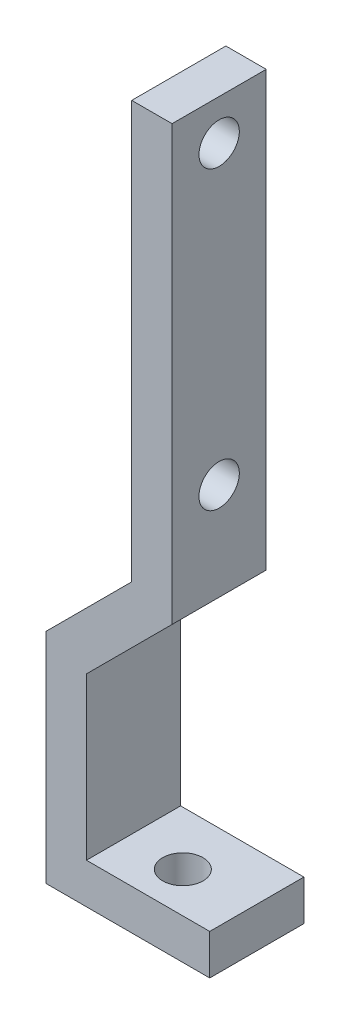
ISO-10303-21;
HEADER;
FILE_DESCRIPTION(('STEP AP214'),'2;1');
FILE_NAME('part.step','',(''),(''),'','','');
FILE_SCHEMA(('AUTOMOTIVE_DESIGN { 1 0 10303 214 1 1 1 1 }'));
ENDSEC;
DATA;
#1=APPLICATION_CONTEXT('core data for automotive mechanical design processes');
#2=APPLICATION_PROTOCOL_DEFINITION('international standard','automotive_design',2000,#1);
#3=PRODUCT_CONTEXT('',#1,'mechanical');
#4=PRODUCT('Part','Part','',(#3));
#5=PRODUCT_RELATED_PRODUCT_CATEGORY('part','',(#4));
#6=PRODUCT_DEFINITION_FORMATION('','',#4);
#7=PRODUCT_DEFINITION_CONTEXT('part definition',#1,'design');
#8=PRODUCT_DEFINITION('design','',#6,#7);
#9=PRODUCT_DEFINITION_SHAPE('','',#8);
#10=(LENGTH_UNIT() NAMED_UNIT(*) SI_UNIT(.MILLI.,.METRE.));
#11=(NAMED_UNIT(*) PLANE_ANGLE_UNIT() SI_UNIT($,.RADIAN.));
#12=(NAMED_UNIT(*) SI_UNIT($,.STERADIAN.) SOLID_ANGLE_UNIT());
#13=UNCERTAINTY_MEASURE_WITH_UNIT(LENGTH_MEASURE(1.E-05),#10,'distance_accuracy_value','');
#14=(GEOMETRIC_REPRESENTATION_CONTEXT(3) GLOBAL_UNCERTAINTY_ASSIGNED_CONTEXT((#13)) GLOBAL_UNIT_ASSIGNED_CONTEXT((#10,
#11,#12)) REPRESENTATION_CONTEXT('',''));
#15=CARTESIAN_POINT('',(0.,0.,0.));
#16=DIRECTION('',(0.,0.,1.));
#17=DIRECTION('',(1.,0.,0.));
#18=AXIS2_PLACEMENT_3D('',#15,#16,#17);
#19=CARTESIAN_POINT('',(0.,-31.6198785237269,7.));
#20=DIRECTION('',(0.,1.,0.));
#21=DIRECTION('',(0.,0.,1.));
#22=AXIS2_PLACEMENT_3D('',#19,#20,#21);
#23=PLANE('',#22);
#24=CARTESIAN_POINT('',(-2.84108024311403,-31.6198785237269,4.));
#25=DIRECTION('',(0.,1.,0.));
#26=DIRECTION('',(0.,0.,1.));
#27=AXIS2_PLACEMENT_3D('',#24,#25,#26);
#28=CIRCLE('',#27,1.5);
#29=CARTESIAN_POINT('',(-2.84108024311403,-31.6198785237269,5.5));
#30=VERTEX_POINT('',#29);
#31=EDGE_CURVE('E220',#30,#30,#28,.T.);
#32=ORIENTED_EDGE('',*,*,#31,.T.);
#33=EDGE_LOOP('',(#32));
#34=FACE_BOUND('',#33,.T.);
#35=DIRECTION('',(1.,0.,0.));
#36=VECTOR('',#35,1.);
#37=CARTESIAN_POINT('',(0.,-31.6198785237269,0.));
#38=LINE('',#37,#36);
#39=CARTESIAN_POINT('',(-10.005041273793,-31.6198785237269,0.));
#40=VERTEX_POINT('',#39);
#41=CARTESIAN_POINT('',(2.15891975688597,-31.6198785237269,0.));
#42=VERTEX_POINT('',#41);
#43=EDGE_CURVE('E145',#40,#42,#38,.T.);
#44=ORIENTED_EDGE('',*,*,#43,.T.);
#45=DIRECTION('',(0.,0.,-1.));
#46=VECTOR('',#45,1.);
#47=CARTESIAN_POINT('',(2.15891975688597,-31.6198785237269,7.));
#48=LINE('',#47,#46);
#49=CARTESIAN_POINT('',(2.15891975688597,-31.6198785237269,7.));
#50=VERTEX_POINT('',#49);
#51=EDGE_CURVE('E11',#50,#42,#48,.T.);
#52=ORIENTED_EDGE('',*,*,#51,.F.);
#53=DIRECTION('',(1.,0.,0.));
#54=VECTOR('',#53,1.);
#55=CARTESIAN_POINT('',(0.,-31.6198785237269,7.));
#56=LINE('',#55,#54);
#57=CARTESIAN_POINT('',(-10.005041273793,-31.6198785237269,7.));
#58=VERTEX_POINT('',#57);
#59=EDGE_CURVE('E164',#58,#50,#56,.T.);
#60=ORIENTED_EDGE('',*,*,#59,.F.);
#61=DIRECTION('',(0.,0.,-1.));
#62=VECTOR('',#61,1.);
#63=CARTESIAN_POINT('',(-10.005041273793,-31.6198785237269,7.));
#64=LINE('',#63,#62);
#65=EDGE_CURVE('E141',#58,#40,#64,.T.);
#66=ORIENTED_EDGE('',*,*,#65,.T.);
#67=EDGE_LOOP('',(#44,#52,#60,#66));
#68=FACE_BOUND('',#67,.T.);
#69=ADVANCED_FACE('F37',(#34,#68),#23,.F.);
#70=CARTESIAN_POINT('',(2.15891975688597,0.,7.));
#71=DIRECTION('',(-1.,0.,0.));
#72=DIRECTION('',(0.,-1.,0.));
#73=AXIS2_PLACEMENT_3D('',#70,#71,#72);
#74=PLANE('',#73);
#75=DIRECTION('',(0.,1.,0.));
#76=VECTOR('',#75,1.);
#77=CARTESIAN_POINT('',(2.15891975688597,0.,0.));
#78=LINE('',#77,#76);
#79=CARTESIAN_POINT('',(2.15891975688597,-28.6198785237269,0.));
#80=VERTEX_POINT('',#79);
#81=EDGE_CURVE('E148',#42,#80,#78,.T.);
#82=ORIENTED_EDGE('',*,*,#81,.T.);
#83=DIRECTION('',(0.,0.,-1.));
#84=VECTOR('',#83,1.);
#85=CARTESIAN_POINT('',(2.15891975688597,-28.6198785237269,7.));
#86=LINE('',#85,#84);
#87=CARTESIAN_POINT('',(2.15891975688597,-28.6198785237269,7.));
#88=VERTEX_POINT('',#87);
#89=EDGE_CURVE('E45',#88,#80,#86,.T.);
#90=ORIENTED_EDGE('',*,*,#89,.F.);
#91=DIRECTION('',(0.,1.,0.));
#92=VECTOR('',#91,1.);
#93=CARTESIAN_POINT('',(2.15891975688597,0.,7.));
#94=LINE('',#93,#92);
#95=EDGE_CURVE('E102',#50,#88,#94,.T.);
#96=ORIENTED_EDGE('',*,*,#95,.F.);
#97=ORIENTED_EDGE('',*,*,#51,.T.);
#98=EDGE_LOOP('',(#82,#90,#96,#97));
#99=FACE_BOUND('',#98,.T.);
#100=ADVANCED_FACE('F233',(#99),#74,.F.);
#101=CARTESIAN_POINT('',(0.,-28.6198785237269,7.));
#102=DIRECTION('',(0.,-1.,0.));
#103=DIRECTION('',(0.,0.,-1.));
#104=AXIS2_PLACEMENT_3D('',#101,#102,#103);
#105=PLANE('',#104);
#106=CARTESIAN_POINT('',(-2.84108024311403,-28.6198785237269,4.));
#107=DIRECTION('',(0.,1.,0.));
#108=DIRECTION('',(0.,0.,1.));
#109=AXIS2_PLACEMENT_3D('',#106,#107,#108);
#110=CIRCLE('',#109,1.5);
#111=CARTESIAN_POINT('',(-2.84108024311403,-28.6198785237269,5.5));
#112=VERTEX_POINT('',#111);
#113=EDGE_CURVE('E225',#112,#112,#110,.T.);
#114=ORIENTED_EDGE('',*,*,#113,.F.);
#115=EDGE_LOOP('',(#114));
#116=FACE_BOUND('',#115,.T.);
#117=DIRECTION('',(-1.,0.,0.));
#118=VECTOR('',#117,1.);
#119=CARTESIAN_POINT('',(0.,-28.6198785237269,0.));
#120=LINE('',#119,#118);
#121=CARTESIAN_POINT('',(-7.00504127379296,-28.6198785237269,0.));
#122=VERTEX_POINT('',#121);
#123=EDGE_CURVE('E151',#80,#122,#120,.T.);
#124=ORIENTED_EDGE('',*,*,#123,.T.);
#125=DIRECTION('',(0.,0.,-1.));
#126=VECTOR('',#125,1.);
#127=CARTESIAN_POINT('',(-7.00504127379296,-28.6198785237269,7.));
#128=LINE('',#127,#126);
#129=CARTESIAN_POINT('',(-7.00504127379296,-28.6198785237269,7.));
#130=VERTEX_POINT('',#129);
#131=EDGE_CURVE('E177',#130,#122,#128,.T.);
#132=ORIENTED_EDGE('',*,*,#131,.F.);
#133=DIRECTION('',(-1.,0.,0.));
#134=VECTOR('',#133,1.);
#135=CARTESIAN_POINT('',(0.,-28.6198785237269,7.));
#136=LINE('',#135,#134);
#137=EDGE_CURVE('E185',#88,#130,#136,.T.);
#138=ORIENTED_EDGE('',*,*,#137,.F.);
#139=ORIENTED_EDGE('',*,*,#89,.T.);
#140=EDGE_LOOP('',(#124,#132,#138,#139));
#141=FACE_BOUND('',#140,.T.);
#142=ADVANCED_FACE('F183',(#116,#141),#105,.F.);
#143=CARTESIAN_POINT('',(-7.00504127379296,0.,7.));
#144=DIRECTION('',(-1.,0.,0.));
#145=DIRECTION('',(0.,-1.,0.));
#146=AXIS2_PLACEMENT_3D('',#143,#144,#145);
#147=PLANE('',#146);
#148=DIRECTION('',(0.,1.,0.));
#149=VECTOR('',#148,1.);
#150=CARTESIAN_POINT('',(-7.00504127379296,0.,0.));
#151=LINE('',#150,#149);
#152=CARTESIAN_POINT('',(-7.00504127379296,-16.6198785237268,0.));
#153=VERTEX_POINT('',#152);
#154=EDGE_CURVE('E153',#122,#153,#151,.T.);
#155=ORIENTED_EDGE('',*,*,#154,.T.);
#156=DIRECTION('',(0.,0.,-1.));
#157=VECTOR('',#156,1.);
#158=CARTESIAN_POINT('',(-7.00504127379296,-16.6198785237268,7.));
#159=LINE('',#158,#157);
#160=CARTESIAN_POINT('',(-7.00504127379296,-16.6198785237268,7.));
#161=VERTEX_POINT('',#160);
#162=EDGE_CURVE('E174',#161,#153,#159,.T.);
#163=ORIENTED_EDGE('',*,*,#162,.F.);
#164=DIRECTION('',(0.,1.,0.));
#165=VECTOR('',#164,1.);
#166=CARTESIAN_POINT('',(-7.00504127379296,0.,7.));
#167=LINE('',#166,#165);
#168=EDGE_CURVE('E203',#130,#161,#167,.T.);
#169=ORIENTED_EDGE('',*,*,#168,.F.);
#170=ORIENTED_EDGE('',*,*,#131,.T.);
#171=EDGE_LOOP('',(#155,#163,#169,#170));
#172=FACE_BOUND('',#171,.T.);
#173=ADVANCED_FACE('F194',(#172),#147,.F.);
#174=CARTESIAN_POINT('',(4.80741862496694,-4.80741862496694,7.));
#175=DIRECTION('',(-0.707106781186547,0.707106781186547,0.));
#176=DIRECTION('',(-0.707106781186548,-0.707106781186548,0.));
#177=AXIS2_PLACEMENT_3D('',#174,#175,#176);
#178=PLANE('',#177);
#179=DIRECTION('',(0.707106781186548,0.707106781186548,0.));
#180=VECTOR('',#179,1.);
#181=CARTESIAN_POINT('',(4.80741862496694,-4.80741862496694,0.));
#182=LINE('',#181,#180);
#183=CARTESIAN_POINT('',(-0.64108024311404,-10.2559174930479,0.));
#184=VERTEX_POINT('',#183);
#185=EDGE_CURVE('E155',#153,#184,#182,.T.);
#186=ORIENTED_EDGE('',*,*,#185,.T.);
#187=DIRECTION('',(0.,0.,-1.));
#188=VECTOR('',#187,1.);
#189=CARTESIAN_POINT('',(-0.64108024311404,-10.2559174930479,7.));
#190=LINE('',#189,#188);
#191=CARTESIAN_POINT('',(-0.64108024311404,-10.2559174930479,7.));
#192=VERTEX_POINT('',#191);
#193=EDGE_CURVE('E171',#192,#184,#190,.T.);
#194=ORIENTED_EDGE('',*,*,#193,.F.);
#195=DIRECTION('',(0.707106781186548,0.707106781186548,0.));
#196=VECTOR('',#195,1.);
#197=CARTESIAN_POINT('',(4.80741862496694,-4.80741862496694,7.));
#198=LINE('',#197,#196);
#199=EDGE_CURVE('E200',#161,#192,#198,.T.);
#200=ORIENTED_EDGE('',*,*,#199,.F.);
#201=ORIENTED_EDGE('',*,*,#162,.T.);
#202=EDGE_LOOP('',(#186,#194,#200,#201));
#203=FACE_BOUND('',#202,.T.);
#204=ADVANCED_FACE('F198',(#203),#178,.F.);
#205=CARTESIAN_POINT('',(-0.641080243114038,0.,7.));
#206=DIRECTION('',(-1.,0.,0.));
#207=DIRECTION('',(0.,0.,1.));
#208=AXIS2_PLACEMENT_3D('',#205,#206,#207);
#209=PLANE('',#208);
#210=CARTESIAN_POINT('',(-0.641080243114038,18.9867231940714,3.5));
#211=DIRECTION('',(-1.,0.,0.));
#212=DIRECTION('',(0.,0.,1.));
#213=AXIS2_PLACEMENT_3D('',#210,#211,#212);
#214=CIRCLE('',#213,1.5);
#215=CARTESIAN_POINT('',(-0.641080243114038,18.9867231940714,5.));
#216=VERTEX_POINT('',#215);
#217=EDGE_CURVE('E149',#216,#216,#214,.T.);
#218=ORIENTED_EDGE('',*,*,#217,.T.);
#219=EDGE_LOOP('',(#218));
#220=FACE_BOUND('',#219,.T.);
#221=CARTESIAN_POINT('',(-0.641080243114039,-3.01327680592863,3.5));
#222=DIRECTION('',(-1.,0.,0.));
#223=DIRECTION('',(0.,0.,1.));
#224=AXIS2_PLACEMENT_3D('',#221,#222,#223);
#225=CIRCLE('',#224,1.5);
#226=CARTESIAN_POINT('',(-0.641080243114039,-3.01327680592863,5.));
#227=VERTEX_POINT('',#226);
#228=EDGE_CURVE('E213',#227,#227,#225,.T.);
#229=ORIENTED_EDGE('',*,*,#228,.T.);
#230=EDGE_LOOP('',(#229));
#231=FACE_BOUND('',#230,.T.);
#232=DIRECTION('',(0.,1.,0.));
#233=VECTOR('',#232,1.);
#234=CARTESIAN_POINT('',(-0.641080243114038,0.,0.));
#235=LINE('',#234,#233);
#236=CARTESIAN_POINT('',(-0.641080243114038,21.9867231940714,0.));
#237=VERTEX_POINT('',#236);
#238=EDGE_CURVE('E157',#184,#237,#235,.T.);
#239=ORIENTED_EDGE('',*,*,#238,.T.);
#240=DIRECTION('',(0.,0.,-1.));
#241=VECTOR('',#240,1.);
#242=CARTESIAN_POINT('',(-0.641080243114038,21.9867231940714,7.));
#243=LINE('',#242,#241);
#244=CARTESIAN_POINT('',(-0.641080243114038,21.9867231940714,7.));
#245=VERTEX_POINT('',#244);
#246=EDGE_CURVE('E168',#245,#237,#243,.T.);
#247=ORIENTED_EDGE('',*,*,#246,.F.);
#248=DIRECTION('',(0.,1.,0.));
#249=VECTOR('',#248,1.);
#250=CARTESIAN_POINT('',(-0.641080243114038,0.,7.));
#251=LINE('',#250,#249);
#252=EDGE_CURVE('E202',#192,#245,#251,.T.);
#253=ORIENTED_EDGE('',*,*,#252,.F.);
#254=ORIENTED_EDGE('',*,*,#193,.T.);
#255=EDGE_LOOP('',(#239,#247,#253,#254));
#256=FACE_BOUND('',#255,.T.);
#257=ADVANCED_FACE('F253',(#220,#231,#256),#209,.F.);
#258=CARTESIAN_POINT('',(0.,21.9867231940714,7.));
#259=DIRECTION('',(0.,-1.,0.));
#260=DIRECTION('',(1.,0.,0.));
#261=AXIS2_PLACEMENT_3D('',#258,#259,#260);
#262=PLANE('',#261);
#263=DIRECTION('',(-1.,0.,0.));
#264=VECTOR('',#263,1.);
#265=CARTESIAN_POINT('',(0.,21.9867231940714,0.));
#266=LINE('',#265,#264);
#267=CARTESIAN_POINT('',(-3.64108024311404,21.9867231940714,0.));
#268=VERTEX_POINT('',#267);
#269=EDGE_CURVE('E159',#237,#268,#266,.T.);
#270=ORIENTED_EDGE('',*,*,#269,.T.);
#271=DIRECTION('',(0.,0.,-1.));
#272=VECTOR('',#271,1.);
#273=CARTESIAN_POINT('',(-3.64108024311404,21.9867231940714,7.));
#274=LINE('',#273,#272);
#275=CARTESIAN_POINT('',(-3.64108024311404,21.9867231940714,7.));
#276=VERTEX_POINT('',#275);
#277=EDGE_CURVE('E136',#276,#268,#274,.T.);
#278=ORIENTED_EDGE('',*,*,#277,.F.);
#279=DIRECTION('',(-1.,0.,0.));
#280=VECTOR('',#279,1.);
#281=CARTESIAN_POINT('',(0.,21.9867231940714,7.));
#282=LINE('',#281,#280);
#283=EDGE_CURVE('E127',#245,#276,#282,.T.);
#284=ORIENTED_EDGE('',*,*,#283,.F.);
#285=ORIENTED_EDGE('',*,*,#246,.T.);
#286=EDGE_LOOP('',(#270,#278,#284,#285));
#287=FACE_BOUND('',#286,.T.);
#288=ADVANCED_FACE('F250',(#287),#262,.F.);
#289=CARTESIAN_POINT('',(-3.64108024311404,0.,7.));
#290=DIRECTION('',(1.,0.,0.));
#291=DIRECTION('',(0.,1.,0.));
#292=AXIS2_PLACEMENT_3D('',#289,#290,#291);
#293=PLANE('',#292);
#294=CARTESIAN_POINT('',(-3.64108024311404,18.9867231940714,3.5));
#295=DIRECTION('',(-1.,0.,0.));
#296=DIRECTION('',(0.,-1.,0.));
#297=AXIS2_PLACEMENT_3D('',#294,#295,#296);
#298=CIRCLE('',#297,1.5);
#299=CARTESIAN_POINT('',(-3.64108024311404,17.4867231940714,3.5));
#300=VERTEX_POINT('',#299);
#301=EDGE_CURVE('E216',#300,#300,#298,.T.);
#302=ORIENTED_EDGE('',*,*,#301,.F.);
#303=EDGE_LOOP('',(#302));
#304=FACE_BOUND('',#303,.T.);
#305=CARTESIAN_POINT('',(-3.64108024311404,-3.01327680592863,3.5));
#306=DIRECTION('',(-1.,0.,0.));
#307=DIRECTION('',(0.,-1.,0.));
#308=AXIS2_PLACEMENT_3D('',#305,#306,#307);
#309=CIRCLE('',#308,1.5);
#310=CARTESIAN_POINT('',(-3.64108024311404,-4.51327680592863,3.5));
#311=VERTEX_POINT('',#310);
#312=EDGE_CURVE('E217',#311,#311,#309,.T.);
#313=ORIENTED_EDGE('',*,*,#312,.F.);
#314=EDGE_LOOP('',(#313));
#315=FACE_BOUND('',#314,.T.);
#316=DIRECTION('',(0.,-1.,0.));
#317=VECTOR('',#316,1.);
#318=CARTESIAN_POINT('',(-3.64108024311404,0.,0.));
#319=LINE('',#318,#317);
#320=CARTESIAN_POINT('',(-3.64108024311403,-9.01327680592864,0.));
#321=VERTEX_POINT('',#320);
#322=EDGE_CURVE('E135',#268,#321,#319,.T.);
#323=ORIENTED_EDGE('',*,*,#322,.T.);
#324=DIRECTION('',(0.,0.,-1.));
#325=VECTOR('',#324,1.);
#326=CARTESIAN_POINT('',(-3.64108024311403,-9.01327680592864,7.));
#327=LINE('',#326,#325);
#328=CARTESIAN_POINT('',(-3.64108024311403,-9.01327680592864,7.));
#329=VERTEX_POINT('',#328);
#330=EDGE_CURVE('E132',#329,#321,#327,.T.);
#331=ORIENTED_EDGE('',*,*,#330,.F.);
#332=DIRECTION('',(0.,-1.,0.));
#333=VECTOR('',#332,1.);
#334=CARTESIAN_POINT('',(-3.64108024311404,0.,7.));
#335=LINE('',#334,#333);
#336=EDGE_CURVE('E121',#276,#329,#335,.T.);
#337=ORIENTED_EDGE('',*,*,#336,.F.);
#338=ORIENTED_EDGE('',*,*,#277,.T.);
#339=EDGE_LOOP('',(#323,#331,#337,#338));
#340=FACE_BOUND('',#339,.T.);
#341=ADVANCED_FACE('F133',(#304,#315,#340),#293,.F.);
#342=CARTESIAN_POINT('',(2.6860982814073,-2.6860982814073,7.));
#343=DIRECTION('',(0.707106781186548,-0.707106781186548,0.));
#344=DIRECTION('',(0.707106781186548,0.707106781186547,0.));
#345=AXIS2_PLACEMENT_3D('',#342,#343,#344);
#346=PLANE('',#345);
#347=DIRECTION('',(-0.707106781186548,-0.707106781186547,0.));
#348=VECTOR('',#347,1.);
#349=CARTESIAN_POINT('',(2.6860982814073,-2.6860982814073,0.));
#350=LINE('',#349,#348);
#351=CARTESIAN_POINT('',(-10.005041273793,-15.3772378366076,0.));
#352=VERTEX_POINT('',#351);
#353=EDGE_CURVE('E88',#321,#352,#350,.T.);
#354=ORIENTED_EDGE('',*,*,#353,.T.);
#355=DIRECTION('',(0.,0.,-1.));
#356=VECTOR('',#355,1.);
#357=CARTESIAN_POINT('',(-10.005041273793,-15.3772378366076,7.));
#358=LINE('',#357,#356);
#359=CARTESIAN_POINT('',(-10.005041273793,-15.3772378366076,7.));
#360=VERTEX_POINT('',#359);
#361=EDGE_CURVE('E137',#360,#352,#358,.T.);
#362=ORIENTED_EDGE('',*,*,#361,.F.);
#363=DIRECTION('',(-0.707106781186548,-0.707106781186547,0.));
#364=VECTOR('',#363,1.);
#365=CARTESIAN_POINT('',(2.6860982814073,-2.6860982814073,7.));
#366=LINE('',#365,#364);
#367=EDGE_CURVE('E125',#329,#360,#366,.T.);
#368=ORIENTED_EDGE('',*,*,#367,.F.);
#369=ORIENTED_EDGE('',*,*,#330,.T.);
#370=EDGE_LOOP('',(#354,#362,#368,#369));
#371=FACE_BOUND('',#370,.T.);
#372=ADVANCED_FACE('F139',(#371),#346,.F.);
#373=CARTESIAN_POINT('',(-10.005041273793,0.,7.));
#374=DIRECTION('',(1.,0.,0.));
#375=DIRECTION('',(0.,1.,0.));
#376=AXIS2_PLACEMENT_3D('',#373,#374,#375);
#377=PLANE('',#376);
#378=DIRECTION('',(0.,-1.,0.));
#379=VECTOR('',#378,1.);
#380=CARTESIAN_POINT('',(-10.005041273793,0.,0.));
#381=LINE('',#380,#379);
#382=EDGE_CURVE('E94',#352,#40,#381,.T.);
#383=ORIENTED_EDGE('',*,*,#382,.T.);
#384=ORIENTED_EDGE('',*,*,#65,.F.);
#385=DIRECTION('',(0.,-1.,0.));
#386=VECTOR('',#385,1.);
#387=CARTESIAN_POINT('',(-10.005041273793,0.,7.));
#388=LINE('',#387,#386);
#389=EDGE_CURVE('E53',#360,#58,#388,.T.);
#390=ORIENTED_EDGE('',*,*,#389,.F.);
#391=ORIENTED_EDGE('',*,*,#361,.T.);
#392=EDGE_LOOP('',(#383,#384,#390,#391));
#393=FACE_BOUND('',#392,.T.);
#394=ADVANCED_FACE('F270',(#393),#377,.F.);
#395=CARTESIAN_POINT('',(0.,0.,7.));
#396=DIRECTION('',(0.,0.,1.));
#397=DIRECTION('',(1.,0.,0.));
#398=AXIS2_PLACEMENT_3D('',#395,#396,#397);
#399=PLANE('',#398);
#400=ORIENTED_EDGE('',*,*,#59,.T.);
#401=ORIENTED_EDGE('',*,*,#95,.T.);
#402=ORIENTED_EDGE('',*,*,#137,.T.);
#403=ORIENTED_EDGE('',*,*,#168,.T.);
#404=ORIENTED_EDGE('',*,*,#199,.T.);
#405=ORIENTED_EDGE('',*,*,#252,.T.);
#406=ORIENTED_EDGE('',*,*,#283,.T.);
#407=ORIENTED_EDGE('',*,*,#336,.T.);
#408=ORIENTED_EDGE('',*,*,#367,.T.);
#409=ORIENTED_EDGE('',*,*,#389,.T.);
#410=EDGE_LOOP('',(#400,#401,#402,#403,#404,#405,#406,#407,#408,#409));
#411=FACE_BOUND('',#410,.T.);
#412=ADVANCED_FACE('F123',(#411),#399,.T.);
#413=CARTESIAN_POINT('',(0.,0.,0.));
#414=DIRECTION('',(0.,0.,1.));
#415=DIRECTION('',(1.,0.,0.));
#416=AXIS2_PLACEMENT_3D('',#413,#414,#415);
#417=PLANE('',#416);
#418=ORIENTED_EDGE('',*,*,#43,.F.);
#419=ORIENTED_EDGE('',*,*,#382,.F.);
#420=ORIENTED_EDGE('',*,*,#353,.F.);
#421=ORIENTED_EDGE('',*,*,#322,.F.);
#422=ORIENTED_EDGE('',*,*,#269,.F.);
#423=ORIENTED_EDGE('',*,*,#238,.F.);
#424=ORIENTED_EDGE('',*,*,#185,.F.);
#425=ORIENTED_EDGE('',*,*,#154,.F.);
#426=ORIENTED_EDGE('',*,*,#123,.F.);
#427=ORIENTED_EDGE('',*,*,#81,.F.);
#428=EDGE_LOOP('',(#418,#419,#420,#421,#422,#423,#424,#425,#426,#427));
#429=FACE_BOUND('',#428,.T.);
#430=ADVANCED_FACE('F189',(#429),#417,.F.);
#431=CARTESIAN_POINT('',(3.35891975688596,-3.01327680592863,3.5));
#432=DIRECTION('',(-1.,0.,0.));
#433=DIRECTION('',(0.,-1.,0.));
#434=AXIS2_PLACEMENT_3D('',#431,#432,#433);
#435=CYLINDRICAL_SURFACE('',#434,1.5);
#436=ORIENTED_EDGE('',*,*,#312,.T.);
#437=EDGE_LOOP('',(#436));
#438=FACE_BOUND('',#437,.T.);
#439=ORIENTED_EDGE('',*,*,#228,.F.);
#440=EDGE_LOOP('',(#439));
#441=FACE_BOUND('',#440,.T.);
#442=ADVANCED_FACE('F275',(#438,#441),#435,.F.);
#443=CARTESIAN_POINT('',(3.35891975688596,18.9867231940714,3.5));
#444=DIRECTION('',(-1.,0.,0.));
#445=DIRECTION('',(0.,-1.,0.));
#446=AXIS2_PLACEMENT_3D('',#443,#444,#445);
#447=CYLINDRICAL_SURFACE('',#446,1.5);
#448=ORIENTED_EDGE('',*,*,#301,.T.);
#449=EDGE_LOOP('',(#448));
#450=FACE_BOUND('',#449,.T.);
#451=ORIENTED_EDGE('',*,*,#217,.F.);
#452=EDGE_LOOP('',(#451));
#453=FACE_BOUND('',#452,.T.);
#454=ADVANCED_FACE('F280',(#450,#453),#447,.F.);
#455=CARTESIAN_POINT('',(-2.84108024311403,-35.6198785237269,4.));
#456=DIRECTION('',(0.,1.,0.));
#457=DIRECTION('',(0.,0.,1.));
#458=AXIS2_PLACEMENT_3D('',#455,#456,#457);
#459=CYLINDRICAL_SURFACE('',#458,1.5);
#460=ORIENTED_EDGE('',*,*,#113,.T.);
#461=EDGE_LOOP('',(#460));
#462=FACE_BOUND('',#461,.T.);
#463=ORIENTED_EDGE('',*,*,#31,.F.);
#464=EDGE_LOOP('',(#463));
#465=FACE_BOUND('',#464,.T.);
#466=ADVANCED_FACE('F229',(#462,#465),#459,.F.);
#467=CLOSED_SHELL('',(#69,#100,#142,#173,#204,#257,#288,#341,#372,#394,#412,#430,#442,#454,#466));
#468=MANIFOLD_SOLID_BREP('B2',#467);
#469=ADVANCED_BREP_SHAPE_REPRESENTATION('',(#18,#468),#14);
#470=SHAPE_DEFINITION_REPRESENTATION(#9,#469);
ENDSEC;
END-ISO-10303-21;
